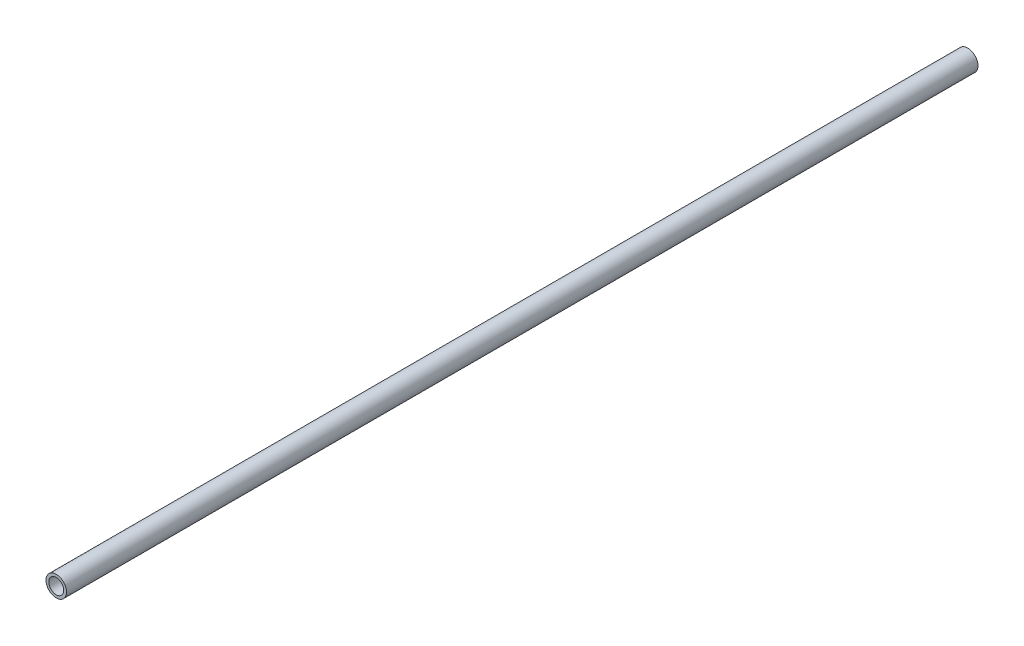
ISO-10303-21;
HEADER;
FILE_DESCRIPTION(('STEP AP214'),'2;1');
FILE_NAME('part.step','',(''),(''),'','','');
FILE_SCHEMA(('AUTOMOTIVE_DESIGN { 1 0 10303 214 1 1 1 1 }'));
ENDSEC;
DATA;
#1=APPLICATION_CONTEXT('core data for automotive mechanical design processes');
#2=APPLICATION_PROTOCOL_DEFINITION('international standard','automotive_design',2000,#1);
#3=PRODUCT_CONTEXT('',#1,'mechanical');
#4=PRODUCT('Part','Part','',(#3));
#5=PRODUCT_RELATED_PRODUCT_CATEGORY('part','',(#4));
#6=PRODUCT_DEFINITION_FORMATION('','',#4);
#7=PRODUCT_DEFINITION_CONTEXT('part definition',#1,'design');
#8=PRODUCT_DEFINITION('design','',#6,#7);
#9=PRODUCT_DEFINITION_SHAPE('','',#8);
#10=(LENGTH_UNIT() NAMED_UNIT(*) SI_UNIT(.MILLI.,.METRE.));
#11=(NAMED_UNIT(*) PLANE_ANGLE_UNIT() SI_UNIT($,.RADIAN.));
#12=(NAMED_UNIT(*) SI_UNIT($,.STERADIAN.) SOLID_ANGLE_UNIT());
#13=UNCERTAINTY_MEASURE_WITH_UNIT(LENGTH_MEASURE(1.E-05),#10,'distance_accuracy_value','');
#14=(GEOMETRIC_REPRESENTATION_CONTEXT(3) GLOBAL_UNCERTAINTY_ASSIGNED_CONTEXT((#13)) GLOBAL_UNIT_ASSIGNED_CONTEXT((#10,
#11,#12)) REPRESENTATION_CONTEXT('',''));
#15=CARTESIAN_POINT('',(0.,0.,0.));
#16=DIRECTION('',(0.,0.,1.));
#17=DIRECTION('',(1.,0.,0.));
#18=AXIS2_PLACEMENT_3D('',#15,#16,#17);
#19=CARTESIAN_POINT('',(0.,0.,381.));
#20=DIRECTION('',(0.,0.,1.));
#21=DIRECTION('',(1.,0.,0.));
#22=AXIS2_PLACEMENT_3D('',#19,#20,#21);
#23=PLANE('',#22);
#24=CARTESIAN_POINT('',(0.,0.,381.));
#25=DIRECTION('',(0.,0.,1.));
#26=DIRECTION('',(1.,0.,0.));
#27=AXIS2_PLACEMENT_3D('',#24,#25,#26);
#28=CIRCLE('',#27,8.5725);
#29=CARTESIAN_POINT('',(8.5725,0.,381.));
#30=VERTEX_POINT('',#29);
#31=EDGE_CURVE('E11',#30,#30,#28,.T.);
#32=ORIENTED_EDGE('',*,*,#31,.T.);
#33=EDGE_LOOP('',(#32));
#34=FACE_BOUND('',#33,.T.);
#35=CARTESIAN_POINT('',(0.,0.,381.));
#36=DIRECTION('',(0.,0.,1.));
#37=DIRECTION('',(1.,0.,0.));
#38=AXIS2_PLACEMENT_3D('',#35,#36,#37);
#39=CIRCLE('',#38,6.2611);
#40=CARTESIAN_POINT('',(6.2611,0.,381.));
#41=VERTEX_POINT('',#40);
#42=EDGE_CURVE('E49',#41,#41,#39,.T.);
#43=ORIENTED_EDGE('',*,*,#42,.F.);
#44=EDGE_LOOP('',(#43));
#45=FACE_BOUND('',#44,.T.);
#46=ADVANCED_FACE('F38',(#34,#45),#23,.T.);
#47=CARTESIAN_POINT('',(0.,0.,-381.));
#48=DIRECTION('',(0.,0.,1.));
#49=DIRECTION('',(1.,0.,0.));
#50=AXIS2_PLACEMENT_3D('',#47,#48,#49);
#51=PLANE('',#50);
#52=CARTESIAN_POINT('',(0.,0.,-381.));
#53=DIRECTION('',(0.,0.,1.));
#54=DIRECTION('',(1.,0.,0.));
#55=AXIS2_PLACEMENT_3D('',#52,#53,#54);
#56=CIRCLE('',#55,8.5725);
#57=CARTESIAN_POINT('',(8.5725,0.,-381.));
#58=VERTEX_POINT('',#57);
#59=EDGE_CURVE('E42',#58,#58,#56,.T.);
#60=ORIENTED_EDGE('',*,*,#59,.F.);
#61=EDGE_LOOP('',(#60));
#62=FACE_BOUND('',#61,.T.);
#63=CARTESIAN_POINT('',(0.,0.,-381.));
#64=DIRECTION('',(0.,0.,1.));
#65=DIRECTION('',(1.,0.,0.));
#66=AXIS2_PLACEMENT_3D('',#63,#64,#65);
#67=CIRCLE('',#66,6.2611);
#68=CARTESIAN_POINT('',(6.2611,0.,-381.));
#69=VERTEX_POINT('',#68);
#70=EDGE_CURVE('E51',#69,#69,#67,.T.);
#71=ORIENTED_EDGE('',*,*,#70,.T.);
#72=EDGE_LOOP('',(#71));
#73=FACE_BOUND('',#72,.T.);
#74=ADVANCED_FACE('F61',(#62,#73),#51,.F.);
#75=CARTESIAN_POINT('',(0.,0.,381.));
#76=DIRECTION('',(0.,0.,-1.));
#77=DIRECTION('',(-1.,0.,0.));
#78=AXIS2_PLACEMENT_3D('',#75,#76,#77);
#79=CYLINDRICAL_SURFACE('',#78,8.5725);
#80=ORIENTED_EDGE('',*,*,#31,.F.);
#81=EDGE_LOOP('',(#80));
#82=FACE_BOUND('',#81,.T.);
#83=ORIENTED_EDGE('',*,*,#59,.T.);
#84=EDGE_LOOP('',(#83));
#85=FACE_BOUND('',#84,.T.);
#86=ADVANCED_FACE('F40',(#82,#85),#79,.T.);
#87=CARTESIAN_POINT('',(0.,0.,381.));
#88=DIRECTION('',(0.,0.,-1.));
#89=DIRECTION('',(-1.,0.,0.));
#90=AXIS2_PLACEMENT_3D('',#87,#88,#89);
#91=CYLINDRICAL_SURFACE('',#90,6.2611);
#92=ORIENTED_EDGE('',*,*,#42,.T.);
#93=EDGE_LOOP('',(#92));
#94=FACE_BOUND('',#93,.T.);
#95=ORIENTED_EDGE('',*,*,#70,.F.);
#96=EDGE_LOOP('',(#95));
#97=FACE_BOUND('',#96,.T.);
#98=ADVANCED_FACE('F57',(#94,#97),#91,.F.);
#99=CLOSED_SHELL('',(#46,#74,#86,#98));
#100=MANIFOLD_SOLID_BREP('B2',#99);
#101=ADVANCED_BREP_SHAPE_REPRESENTATION('',(#18,#100),#14);
#102=SHAPE_DEFINITION_REPRESENTATION(#9,#101);
ENDSEC;
END-ISO-10303-21;
